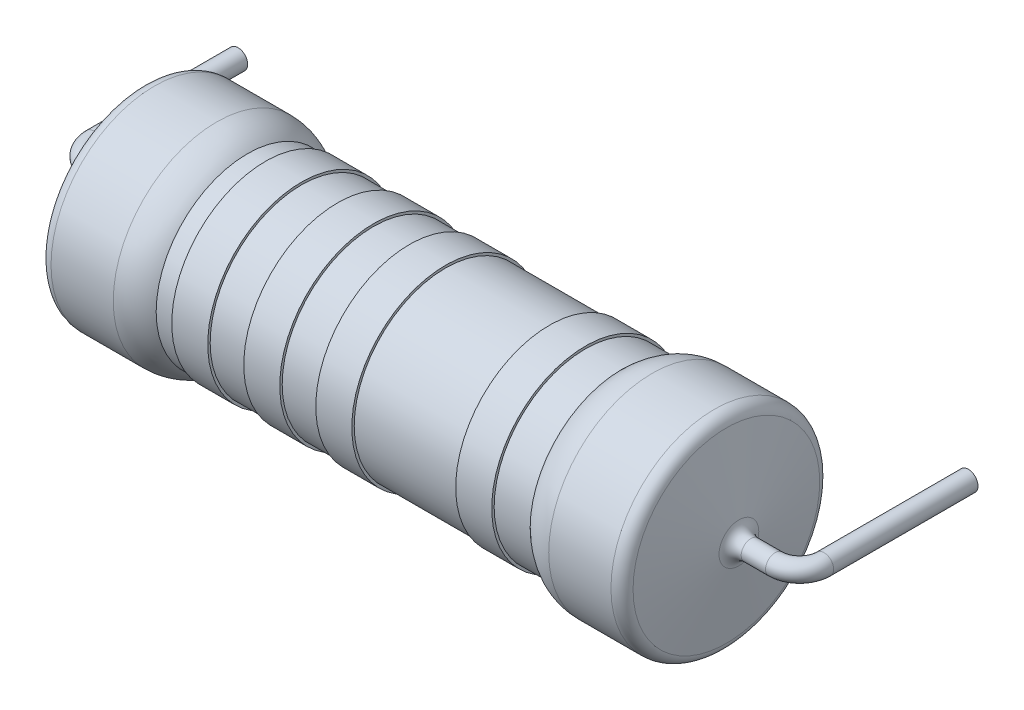
ISO-10303-21;
HEADER;
FILE_DESCRIPTION(('STEP AP214'),'2;1');
FILE_NAME('part.step','',(''),(''),'','','');
FILE_SCHEMA(('AUTOMOTIVE_DESIGN { 1 0 10303 214 1 1 1 1 }'));
ENDSEC;
DATA;
#1=APPLICATION_CONTEXT('core data for automotive mechanical design processes');
#2=APPLICATION_PROTOCOL_DEFINITION('international standard','automotive_design',2000,#1);
#3=PRODUCT_CONTEXT('',#1,'mechanical');
#4=PRODUCT('Part','Part','',(#3));
#5=PRODUCT_RELATED_PRODUCT_CATEGORY('part','',(#4));
#6=PRODUCT_DEFINITION_FORMATION('','',#4);
#7=PRODUCT_DEFINITION_CONTEXT('part definition',#1,'design');
#8=PRODUCT_DEFINITION('design','',#6,#7);
#9=PRODUCT_DEFINITION_SHAPE('','',#8);
#10=(LENGTH_UNIT() NAMED_UNIT(*) SI_UNIT(.MILLI.,.METRE.));
#11=(NAMED_UNIT(*) PLANE_ANGLE_UNIT() SI_UNIT($,.RADIAN.));
#12=(NAMED_UNIT(*) SI_UNIT($,.STERADIAN.) SOLID_ANGLE_UNIT());
#13=UNCERTAINTY_MEASURE_WITH_UNIT(LENGTH_MEASURE(1.E-05),#10,'distance_accuracy_value','');
#14=(GEOMETRIC_REPRESENTATION_CONTEXT(3) GLOBAL_UNCERTAINTY_ASSIGNED_CONTEXT((#13)) GLOBAL_UNIT_ASSIGNED_CONTEXT((#10,
#11,#12)) REPRESENTATION_CONTEXT('',''));
#15=CARTESIAN_POINT('',(0.,0.,0.));
#16=DIRECTION('',(0.,0.,1.));
#17=DIRECTION('',(1.,0.,0.));
#18=AXIS2_PLACEMENT_3D('',#15,#16,#17);
#19=CARTESIAN_POINT('',(-15.,0.2,-6.9292036732051));
#20=DIRECTION('',(0.,0.,-1.));
#21=DIRECTION('',(-1.,0.,0.));
#22=AXIS2_PLACEMENT_3D('',#19,#20,#21);
#23=PLANE('',#22);
#24=CARTESIAN_POINT('',(-15.,0.,-6.9292036732051));
#25=DIRECTION('',(0.,0.,1.));
#26=DIRECTION('',(1.,0.,0.));
#27=AXIS2_PLACEMENT_3D('',#24,#25,#26);
#28=CIRCLE('',#27,0.4);
#29=CARTESIAN_POINT('',(-14.6,0.,-6.9292036732051));
#30=VERTEX_POINT('',#29);
#31=EDGE_CURVE('E16',#30,#30,#28,.T.);
#32=ORIENTED_EDGE('',*,*,#31,.F.);
#33=EDGE_LOOP('',(#32));
#34=FACE_BOUND('',#33,.T.);
#35=ADVANCED_FACE('F13',(#34),#23,.T.);
#36=CARTESIAN_POINT('',(-15.,0.,-2.6792036732051));
#37=DIRECTION('',(0.,0.,1.));
#38=DIRECTION('',(1.,0.,0.));
#39=AXIS2_PLACEMENT_3D('',#36,#37,#38);
#40=CYLINDRICAL_SURFACE('',#39,0.4);
#41=CARTESIAN_POINT('',(-15.,0.,-1.));
#42=DIRECTION('',(0.,0.,-1.));
#43=DIRECTION('',(-1.,0.,0.));
#44=AXIS2_PLACEMENT_3D('',#41,#42,#43);
#45=CIRCLE('',#44,0.4);
#46=CARTESIAN_POINT('',(-15.4,0.,-1.));
#47=VERTEX_POINT('',#46);
#48=EDGE_CURVE('E140',#47,#47,#45,.F.);
#49=ORIENTED_EDGE('',*,*,#48,.F.);
#50=EDGE_LOOP('',(#49));
#51=FACE_BOUND('',#50,.T.);
#52=ORIENTED_EDGE('',*,*,#31,.T.);
#53=EDGE_LOOP('',(#52));
#54=FACE_BOUND('',#53,.T.);
#55=ADVANCED_FACE('F146',(#51,#54),#40,.T.);
#56=CARTESIAN_POINT('',(-14.,0.,-1.));
#57=DIRECTION('',(0.,-1.,0.));
#58=DIRECTION('',(0.,0.,-1.));
#59=AXIS2_PLACEMENT_3D('',#56,#57,#58);
#60=TOROIDAL_SURFACE('',#59,1.,0.4);
#61=CARTESIAN_POINT('',(-14.,0.,0.));
#62=DIRECTION('',(1.,0.,0.));
#63=DIRECTION('',(0.,0.,-1.));
#64=AXIS2_PLACEMENT_3D('',#61,#62,#63);
#65=CIRCLE('',#64,0.4);
#66=CARTESIAN_POINT('',(-14.,0.,-0.4));
#67=VERTEX_POINT('',#66);
#68=EDGE_CURVE('E135',#67,#67,#65,.T.);
#69=ORIENTED_EDGE('',*,*,#68,.F.);
#70=EDGE_LOOP('',(#69));
#71=FACE_BOUND('',#70,.T.);
#72=ORIENTED_EDGE('',*,*,#48,.T.);
#73=EDGE_LOOP('',(#72));
#74=FACE_BOUND('',#73,.T.);
#75=ADVANCED_FACE('F144',(#71,#74),#60,.T.);
#76=CARTESIAN_POINT('',(-17.25,0.,0.));
#77=DIRECTION('',(1.,0.,0.));
#78=DIRECTION('',(0.,0.,-1.));
#79=AXIS2_PLACEMENT_3D('',#76,#77,#78);
#80=CYLINDRICAL_SURFACE('',#79,0.4);
#81=CARTESIAN_POINT('',(-13.,0.,0.));
#82=DIRECTION('',(1.,0.,0.));
#83=DIRECTION('',(0.,0.,-1.));
#84=AXIS2_PLACEMENT_3D('',#81,#82,#83);
#85=CIRCLE('',#84,0.400000000000004);
#86=CARTESIAN_POINT('',(-13.,0.,-0.400000000000004));
#87=VERTEX_POINT('',#86);
#88=EDGE_CURVE('E131',#87,#87,#85,.F.);
#89=ORIENTED_EDGE('',*,*,#88,.T.);
#90=EDGE_LOOP('',(#89));
#91=FACE_BOUND('',#90,.T.);
#92=ORIENTED_EDGE('',*,*,#68,.T.);
#93=EDGE_LOOP('',(#92));
#94=FACE_BOUND('',#93,.T.);
#95=ADVANCED_FACE('F123',(#91,#94),#80,.T.);
#96=CARTESIAN_POINT('',(-13.,0.,0.));
#97=DIRECTION('',(1.,0.,0.));
#98=DIRECTION('',(0.,0.,-1.));
#99=AXIS2_PLACEMENT_3D('',#96,#97,#98);
#100=TOROIDAL_SURFACE('',#99,0.9,0.499999999999996);
#101=ORIENTED_EDGE('',*,*,#88,.F.);
#102=EDGE_LOOP('',(#101));
#103=FACE_BOUND('',#102,.T.);
#104=CARTESIAN_POINT('',(-12.5071032270512,0.,0.));
#105=DIRECTION('',(1.,0.,0.));
#106=DIRECTION('',(0.,1.,0.));
#107=AXIS2_PLACEMENT_3D('',#104,#105,#106);
#108=CIRCLE('',#107,0.816019241085542);
#109=CARTESIAN_POINT('',(-12.5071032270512,0.,-0.816019241081816));
#110=VERTEX_POINT('',#109);
#111=EDGE_CURVE('E134',#110,#110,#108,.T.);
#112=ORIENTED_EDGE('',*,*,#111,.F.);
#113=EDGE_LOOP('',(#112));
#114=FACE_BOUND('',#113,.T.);
#115=ADVANCED_FACE('F118',(#103,#114),#100,.F.);
#116=CARTESIAN_POINT('',(-11.992896774629,0.,0.));
#117=DIRECTION('',(1.,0.,0.));
#118=DIRECTION('',(0.,0.,-1.));
#119=AXIS2_PLACEMENT_3D('',#116,#117,#118);
#120=CONICAL_SURFACE('',#119,3.83398075911145,1.40203487996269);
#121=CARTESIAN_POINT('',(-11.9928967762545,0.,0.));
#122=DIRECTION('',(1.,0.,0.));
#123=DIRECTION('',(0.,0.,-1.));
#124=AXIS2_PLACEMENT_3D('',#121,#122,#123);
#125=CIRCLE('',#124,3.83398075945071);
#126=CARTESIAN_POINT('',(-11.9928967762545,0.,-3.83398074957118));
#127=VERTEX_POINT('',#126);
#128=EDGE_CURVE('E94',#127,#127,#125,.T.);
#129=CARTESIAN_POINT('',(-12.5071032270512,0.,-0.816019241081816));
#130=CARTESIAN_POINT('',(-12.5017469098554,0.,-0.84745634012858));
#131=CARTESIAN_POINT('',(-12.4963905926596,0.,-0.878893439175344));
#132=CARTESIAN_POINT('',(-12.485677958268,0.,-0.941767637268873));
#133=CARTESIAN_POINT('',(-12.4803216410722,0.,-0.973204736315637));
#134=CARTESIAN_POINT('',(-12.4696090066806,0.,-1.03607893440916));
#135=CARTESIAN_POINT('',(-12.4642526894848,0.,-1.06751603345593));
#136=CARTESIAN_POINT('',(-12.4535400550932,0.,-1.13039023154946));
#137=CARTESIAN_POINT('',(-12.4481837378974,0.,-1.16182733059622));
#138=CARTESIAN_POINT('',(-12.4374711035058,0.,-1.22470152868975));
#139=CARTESIAN_POINT('',(-12.43211478631,0.,-1.25613862773651));
#140=CARTESIAN_POINT('',(-12.4214021519184,0.,-1.31901282583004));
#141=CARTESIAN_POINT('',(-12.4160458347226,0.,-1.35044992487681));
#142=CARTESIAN_POINT('',(-12.405333200331,0.,-1.41332412297034));
#143=CARTESIAN_POINT('',(-12.3999768831352,0.,-1.4447612220171));
#144=CARTESIAN_POINT('',(-12.3892642487436,0.,-1.50763542011063));
#145=CARTESIAN_POINT('',(-12.3839079315478,0.,-1.53907251915739));
#146=CARTESIAN_POINT('',(-12.3731952971562,0.,-1.60194671725092));
#147=CARTESIAN_POINT('',(-12.3678389799604,0.,-1.63338381629768));
#148=CARTESIAN_POINT('',(-12.3571263455688,0.,-1.69625801439121));
#149=CARTESIAN_POINT('',(-12.351770028373,0.,-1.72769511343798));
#150=CARTESIAN_POINT('',(-12.3410573939814,0.,-1.7905693115315));
#151=CARTESIAN_POINT('',(-12.3357010767856,0.,-1.82200641057827));
#152=CARTESIAN_POINT('',(-12.324988442394,0.,-1.8848806086718));
#153=CARTESIAN_POINT('',(-12.3196321251982,0.,-1.91631770771856));
#154=CARTESIAN_POINT('',(-12.3089194908066,0.,-1.97919190581209));
#155=CARTESIAN_POINT('',(-12.3035631736108,0.,-2.01062900485885));
#156=CARTESIAN_POINT('',(-12.2928505392192,0.,-2.07350320295238));
#157=CARTESIAN_POINT('',(-12.2874942220234,0.,-2.10494030199915));
#158=CARTESIAN_POINT('',(-12.2767815876318,0.,-2.16781450009268));
#159=CARTESIAN_POINT('',(-12.271425270436,0.,-2.19925159913944));
#160=CARTESIAN_POINT('',(-12.2607126360444,0.,-2.26212579723297));
#161=CARTESIAN_POINT('',(-12.2553563188486,0.,-2.29356289627973));
#162=CARTESIAN_POINT('',(-12.244643684457,0.,-2.35643709437326));
#163=CARTESIAN_POINT('',(-12.2392873672612,0.,-2.38787419342002));
#164=CARTESIAN_POINT('',(-12.2285747328696,0.,-2.45074839151355));
#165=CARTESIAN_POINT('',(-12.2232184156738,0.,-2.48218549056032));
#166=CARTESIAN_POINT('',(-12.2125057812822,0.,-2.54505968865384));
#167=CARTESIAN_POINT('',(-12.2071494640864,0.,-2.57649678770061));
#168=CARTESIAN_POINT('',(-12.1964368296948,0.,-2.63937098579414));
#169=CARTESIAN_POINT('',(-12.1910805124991,0.,-2.6708080848409));
#170=CARTESIAN_POINT('',(-12.1803678781075,0.,-2.73368228293443));
#171=CARTESIAN_POINT('',(-12.1750115609117,0.,-2.76511938198119));
#172=CARTESIAN_POINT('',(-12.1642989265201,0.,-2.82799358007472));
#173=CARTESIAN_POINT('',(-12.1589426093243,0.,-2.85943067912149));
#174=CARTESIAN_POINT('',(-12.1482299749327,0.,-2.92230487721502));
#175=CARTESIAN_POINT('',(-12.1428736577369,0.,-2.95374197626178));
#176=CARTESIAN_POINT('',(-12.1321610233453,0.,-3.01661617435531));
#177=CARTESIAN_POINT('',(-12.1268047061495,0.,-3.04805327340207));
#178=CARTESIAN_POINT('',(-12.1160920717579,0.,-3.1109274714956));
#179=CARTESIAN_POINT('',(-12.1107357545621,0.,-3.14236457054236));
#180=CARTESIAN_POINT('',(-12.1000231201705,0.,-3.20523876863589));
#181=CARTESIAN_POINT('',(-12.0946668029747,0.,-3.23667586768266));
#182=CARTESIAN_POINT('',(-12.0839541685831,0.,-3.29955006577618));
#183=CARTESIAN_POINT('',(-12.0785978513873,0.,-3.33098716482295));
#184=CARTESIAN_POINT('',(-12.0678852169957,0.,-3.39386136291648));
#185=CARTESIAN_POINT('',(-12.0625288997999,0.,-3.42529846196324));
#186=CARTESIAN_POINT('',(-12.0518162654083,0.,-3.48817266005677));
#187=CARTESIAN_POINT('',(-12.0464599482125,0.,-3.51960975910353));
#188=CARTESIAN_POINT('',(-12.0357473138209,0.,-3.58248395719706));
#189=CARTESIAN_POINT('',(-12.0303909966251,0.,-3.61392105624383));
#190=CARTESIAN_POINT('',(-12.0196783622335,0.,-3.67679525433735));
#191=CARTESIAN_POINT('',(-12.0143220450377,0.,-3.70823235338412));
#192=CARTESIAN_POINT('',(-12.0036094106461,0.,-3.77110655147765));
#193=CARTESIAN_POINT('',(-11.9982530934503,0.,-3.80254365052441));
#194=CARTESIAN_POINT('',(-11.9928967762545,0.,-3.83398074957118));
#195=B_SPLINE_CURVE_WITH_KNOTS('',3,(#129,#130,#131,#132,#133,#134,#135,#136,#137,#138,#139,
#140,#141,#142,#143,#144,#145,#146,#147,#148,#149,#150,#151,#152,#153,#154,#155,#156,#157,#158,
#159,#160,#161,#162,#163,#164,#165,#166,#167,#168,#169,#170,#171,#172,#173,#174,#175,#176,#177,
#178,#179,#180,#181,#182,#183,#184,#185,#186,#187,#188,#189,#190,#191,#192,#193,#194),
.UNSPECIFIED.,.F.,.F.,(4,2,2,2,2,2,2,2,2,2,2,2,2,2,2,2,2,2,2,2,2,2,2,2,2,2,2,2,2,2,2,2,4),(0.,
0.0956704341654333,0.191340868330867,0.287011302496301,0.382681736661735,0.478352170827169,
0.574022604992603,0.669693039158037,0.765363473323471,0.861033907488905,0.956704341654339,
1.05237477581977,1.14804520998521,1.24371564415064,1.33938607831607,1.43505651248151,
1.53072694664694,1.62639738081238,1.72206781497781,1.81773824914324,1.91340868330868,
2.00907911747411,2.10474955163955,2.20041998580498,2.29609041997041,2.39176085413585,
2.48743128830128,2.58310172246672,2.67877215663215,2.77444259079758,2.87011302496302,
2.96578345912845,3.06145389329388),.UNSPECIFIED.);
#196=EDGE_CURVE('BSEAM113',#110,#127,#195,.T.);
#197=ORIENTED_EDGE('',*,*,#111,.T.);
#198=ORIENTED_EDGE('',*,*,#128,.F.);
#199=ORIENTED_EDGE('',*,*,#196,.T.);
#200=ORIENTED_EDGE('',*,*,#196,.F.);
#201=EDGE_LOOP('',(#197,#199,#198,#200));
#202=FACE_BOUND('',#201,.T.);
#203=ADVANCED_FACE('F113',(#202),#120,.T.);
#204=CARTESIAN_POINT('',(-11.5,0.,0.));
#205=DIRECTION('',(1.,0.,0.));
#206=DIRECTION('',(0.,0.,-1.));
#207=AXIS2_PLACEMENT_3D('',#204,#205,#206);
#208=TOROIDAL_SURFACE('',#207,3.75000000000001,0.5);
#209=ORIENTED_EDGE('',*,*,#128,.T.);
#210=EDGE_LOOP('',(#209));
#211=FACE_BOUND('',#210,.T.);
#212=CARTESIAN_POINT('',(-11.5,0.,0.));
#213=DIRECTION('',(1.,0.,0.));
#214=DIRECTION('',(0.,0.,-1.));
#215=AXIS2_PLACEMENT_3D('',#212,#213,#214);
#216=CIRCLE('',#215,4.25000000000002);
#217=CARTESIAN_POINT('',(-11.5,0.,-4.25000000000002));
#218=VERTEX_POINT('',#217);
#219=EDGE_CURVE('E89',#218,#218,#216,.T.);
#220=ORIENTED_EDGE('',*,*,#219,.F.);
#221=EDGE_LOOP('',(#220));
#222=FACE_BOUND('',#221,.T.);
#223=ADVANCED_FACE('F108',(#211,#222),#208,.T.);
#224=CARTESIAN_POINT('',(-10.2222222222222,0.,0.));
#225=DIRECTION('',(1.,0.,0.));
#226=DIRECTION('',(0.,0.,-1.));
#227=AXIS2_PLACEMENT_3D('',#224,#225,#226);
#228=CYLINDRICAL_SURFACE('',#227,4.25000000000002);
#229=ORIENTED_EDGE('',*,*,#219,.T.);
#230=EDGE_LOOP('',(#229));
#231=FACE_BOUND('',#230,.T.);
#232=CARTESIAN_POINT('',(-8.94444444444443,0.,0.));
#233=DIRECTION('',(1.,0.,0.));
#234=DIRECTION('',(0.,0.,-1.));
#235=AXIS2_PLACEMENT_3D('',#232,#233,#234);
#236=CIRCLE('',#235,4.25000000000002);
#237=CARTESIAN_POINT('',(-8.94444444444443,0.,-4.25000000000002));
#238=VERTEX_POINT('',#237);
#239=EDGE_CURVE('E82',#238,#238,#236,.T.);
#240=ORIENTED_EDGE('',*,*,#239,.F.);
#241=EDGE_LOOP('',(#240));
#242=FACE_BOUND('',#241,.T.);
#243=ADVANCED_FACE('F112',(#231,#242),#228,.T.);
#244=CARTESIAN_POINT('',(15.,0.2,-6.9292036732051));
#245=DIRECTION('',(0.,0.,-1.));
#246=DIRECTION('',(-1.,0.,0.));
#247=AXIS2_PLACEMENT_3D('',#244,#245,#246);
#248=PLANE('',#247);
#249=CARTESIAN_POINT('',(15.,0.,-6.9292036732051));
#250=DIRECTION('',(0.,0.,-1.));
#251=DIRECTION('',(-1.,0.,0.));
#252=AXIS2_PLACEMENT_3D('',#249,#250,#251);
#253=CIRCLE('',#252,0.4);
#254=CARTESIAN_POINT('',(14.6,0.,-6.9292036732051));
#255=VERTEX_POINT('',#254);
#256=EDGE_CURVE('E79',#255,#255,#253,.F.);
#257=ORIENTED_EDGE('',*,*,#256,.F.);
#258=EDGE_LOOP('',(#257));
#259=FACE_BOUND('',#258,.T.);
#260=ADVANCED_FACE('F295',(#259),#248,.T.);
#261=CARTESIAN_POINT('',(-8.94444444444443,0.,0.));
#262=DIRECTION('',(1.,0.,0.));
#263=DIRECTION('',(0.,0.,-1.));
#264=AXIS2_PLACEMENT_3D('',#261,#262,#263);
#265=TOROIDAL_SURFACE('',#264,2.40847678537188,1.84152321462815);
#266=ORIENTED_EDGE('',*,*,#239,.T.);
#267=EDGE_LOOP('',(#266));
#268=FACE_BOUND('',#267,.T.);
#269=CARTESIAN_POINT('',(-7.64229089168111,0.,0.));
#270=DIRECTION('',(-1.,0.,0.));
#271=DIRECTION('',(0.,1.,0.));
#272=AXIS2_PLACEMENT_3D('',#269,#270,#271);
#273=CIRCLE('',#272,3.71063033821883);
#274=CARTESIAN_POINT('',(-7.64229089168111,3.71063033821883,0.));
#275=VERTEX_POINT('',#274);
#276=EDGE_CURVE('E81',#275,#275,#273,.T.);
#277=ORIENTED_EDGE('',*,*,#276,.T.);
#278=EDGE_LOOP('',(#277));
#279=FACE_BOUND('',#278,.T.);
#280=ADVANCED_FACE('F292',(#268,#279),#265,.T.);
#281=CARTESIAN_POINT('',(15.,0.,-2.6792036732051));
#282=DIRECTION('',(0.,0.,-1.));
#283=DIRECTION('',(-1.,0.,0.));
#284=AXIS2_PLACEMENT_3D('',#281,#282,#283);
#285=CYLINDRICAL_SURFACE('',#284,0.4);
#286=CARTESIAN_POINT('',(15.,0.,-1.));
#287=DIRECTION('',(0.,0.,-1.));
#288=DIRECTION('',(1.,0.,0.));
#289=AXIS2_PLACEMENT_3D('',#286,#287,#288);
#290=CIRCLE('',#289,0.4);
#291=CARTESIAN_POINT('',(15.4,0.,-1.));
#292=VERTEX_POINT('',#291);
#293=EDGE_CURVE('E86',#292,#292,#290,.F.);
#294=ORIENTED_EDGE('',*,*,#293,.F.);
#295=EDGE_LOOP('',(#294));
#296=FACE_BOUND('',#295,.T.);
#297=ORIENTED_EDGE('',*,*,#256,.T.);
#298=EDGE_LOOP('',(#297));
#299=FACE_BOUND('',#298,.T.);
#300=ADVANCED_FACE('F288',(#296,#299),#285,.T.);
#301=CARTESIAN_POINT('',(-7.68166055348729,0.,0.));
#302=DIRECTION('',(-1.,0.,0.));
#303=DIRECTION('',(0.,0.,1.));
#304=AXIS2_PLACEMENT_3D('',#301,#302,#303);
#305=CONICAL_SURFACE('',#304,3.74999999991132,0.785398162675529);
#306=ORIENTED_EDGE('',*,*,#276,.F.);
#307=EDGE_LOOP('',(#306));
#308=FACE_BOUND('',#307,.T.);
#309=CARTESIAN_POINT('',(-7.68166055352042,0.,0.));
#310=DIRECTION('',(1.,0.,0.));
#311=DIRECTION('',(0.,0.,-1.));
#312=AXIS2_PLACEMENT_3D('',#309,#310,#311);
#313=CIRCLE('',#312,3.74999999999995);
#314=CARTESIAN_POINT('',(-7.68166055352042,0.,-3.74999999999995));
#315=VERTEX_POINT('',#314);
#316=EDGE_CURVE('E268',#315,#315,#313,.T.);
#317=ORIENTED_EDGE('',*,*,#316,.F.);
#318=EDGE_LOOP('',(#317));
#319=FACE_BOUND('',#318,.T.);
#320=ADVANCED_FACE('F284',(#308,#319),#305,.F.);
#321=CARTESIAN_POINT('',(14.,0.,-1.));
#322=DIRECTION('',(0.,1.,0.));
#323=DIRECTION('',(0.,0.,1.));
#324=AXIS2_PLACEMENT_3D('',#321,#322,#323);
#325=TOROIDAL_SURFACE('',#324,1.,0.4);
#326=CARTESIAN_POINT('',(14.,0.,0.));
#327=DIRECTION('',(1.,0.,0.));
#328=DIRECTION('',(0.,0.,-1.));
#329=AXIS2_PLACEMENT_3D('',#326,#327,#328);
#330=CIRCLE('',#329,0.4);
#331=CARTESIAN_POINT('',(14.,0.,-0.4));
#332=VERTEX_POINT('',#331);
#333=EDGE_CURVE('E78',#332,#332,#330,.F.);
#334=ORIENTED_EDGE('',*,*,#333,.F.);
#335=EDGE_LOOP('',(#334));
#336=FACE_BOUND('',#335,.T.);
#337=ORIENTED_EDGE('',*,*,#293,.T.);
#338=EDGE_LOOP('',(#337));
#339=FACE_BOUND('',#338,.T.);
#340=ADVANCED_FACE('F279',(#336,#339),#325,.T.);
#341=CARTESIAN_POINT('',(0.,0.,0.));
#342=DIRECTION('',(1.,0.,0.));
#343=DIRECTION('',(0.,0.,-1.));
#344=AXIS2_PLACEMENT_3D('',#341,#342,#343);
#345=CYLINDRICAL_SURFACE('',#344,3.74999999999995);
#346=ORIENTED_EDGE('',*,*,#316,.T.);
#347=EDGE_LOOP('',(#346));
#348=FACE_BOUND('',#347,.T.);
#349=CARTESIAN_POINT('',(-6.94203655268967,0.,0.));
#350=DIRECTION('',(1.,0.,0.));
#351=DIRECTION('',(0.,0.,-1.));
#352=AXIS2_PLACEMENT_3D('',#349,#350,#351);
#353=CIRCLE('',#352,3.74999999999995);
#354=CARTESIAN_POINT('',(-6.94203655268967,0.,-3.74999999999995));
#355=VERTEX_POINT('',#354);
#356=EDGE_CURVE('E76',#355,#355,#353,.T.);
#357=ORIENTED_EDGE('',*,*,#356,.F.);
#358=EDGE_LOOP('',(#357));
#359=FACE_BOUND('',#358,.T.);
#360=ADVANCED_FACE('F283',(#348,#359),#345,.T.);
#361=CARTESIAN_POINT('',(17.25,0.,0.));
#362=DIRECTION('',(1.,0.,0.));
#363=DIRECTION('',(0.,0.,-1.));
#364=AXIS2_PLACEMENT_3D('',#361,#362,#363);
#365=CYLINDRICAL_SURFACE('',#364,0.4);
#366=CARTESIAN_POINT('',(13.,0.,0.));
#367=DIRECTION('',(1.,0.,0.));
#368=DIRECTION('',(0.,0.,-1.));
#369=AXIS2_PLACEMENT_3D('',#366,#367,#368);
#370=CIRCLE('',#369,0.400000000000004);
#371=CARTESIAN_POINT('',(13.,0.,-0.400000000000004));
#372=VERTEX_POINT('',#371);
#373=EDGE_CURVE('E75',#372,#372,#370,.T.);
#374=ORIENTED_EDGE('',*,*,#373,.T.);
#375=EDGE_LOOP('',(#374));
#376=FACE_BOUND('',#375,.T.);
#377=ORIENTED_EDGE('',*,*,#333,.T.);
#378=EDGE_LOOP('',(#377));
#379=FACE_BOUND('',#378,.T.);
#380=ADVANCED_FACE('F447',(#376,#379),#365,.T.);
#381=CARTESIAN_POINT('',(-6.94203655268967,0.,-3.8));
#382=DIRECTION('',(-1.,0.,0.));
#383=DIRECTION('',(0.,0.,1.));
#384=AXIS2_PLACEMENT_3D('',#381,#382,#383);
#385=PLANE('',#384);
#386=ORIENTED_EDGE('',*,*,#356,.T.);
#387=EDGE_LOOP('',(#386));
#388=FACE_BOUND('',#387,.T.);
#389=CARTESIAN_POINT('',(-6.94203655268967,0.,0.));
#390=DIRECTION('',(1.,0.,0.));
#391=DIRECTION('',(0.,0.,-1.));
#392=AXIS2_PLACEMENT_3D('',#389,#390,#391);
#393=CIRCLE('',#392,3.85);
#394=CARTESIAN_POINT('',(-6.94203655268967,0.,-3.85));
#395=VERTEX_POINT('',#394);
#396=EDGE_CURVE('E72',#395,#395,#393,.T.);
#397=ORIENTED_EDGE('',*,*,#396,.F.);
#398=EDGE_LOOP('',(#397));
#399=FACE_BOUND('',#398,.T.);
#400=ADVANCED_FACE('F254',(#388,#399),#385,.T.);
#401=CARTESIAN_POINT('',(13.,0.,0.));
#402=DIRECTION('',(1.,0.,0.));
#403=DIRECTION('',(0.,0.,-1.));
#404=AXIS2_PLACEMENT_3D('',#401,#402,#403);
#405=TOROIDAL_SURFACE('',#404,0.9,0.499999999999996);
#406=CARTESIAN_POINT('',(12.5071032270512,0.,0.));
#407=DIRECTION('',(-1.,0.,0.));
#408=DIRECTION('',(0.,1.,0.));
#409=AXIS2_PLACEMENT_3D('',#406,#407,#408);
#410=CIRCLE('',#409,0.816019241085542);
#411=CARTESIAN_POINT('',(12.5071032270512,0.,0.816019241081816));
#412=VERTEX_POINT('',#411);
#413=EDGE_CURVE('E71',#412,#412,#410,.T.);
#414=ORIENTED_EDGE('',*,*,#413,.F.);
#415=EDGE_LOOP('',(#414));
#416=FACE_BOUND('',#415,.T.);
#417=ORIENTED_EDGE('',*,*,#373,.F.);
#418=EDGE_LOOP('',(#417));
#419=FACE_BOUND('',#418,.T.);
#420=ADVANCED_FACE('F249',(#416,#419),#405,.F.);
#421=CARTESIAN_POINT('',(-6.20241255185892,0.,0.));
#422=DIRECTION('',(1.,0.,0.));
#423=DIRECTION('',(0.,0.,-1.));
#424=AXIS2_PLACEMENT_3D('',#421,#422,#423);
#425=CYLINDRICAL_SURFACE('',#424,3.85);
#426=ORIENTED_EDGE('',*,*,#396,.T.);
#427=EDGE_LOOP('',(#426));
#428=FACE_BOUND('',#427,.T.);
#429=CARTESIAN_POINT('',(-5.46278855102816,0.,0.));
#430=DIRECTION('',(1.,0.,0.));
#431=DIRECTION('',(0.,0.,-1.));
#432=AXIS2_PLACEMENT_3D('',#429,#430,#431);
#433=CIRCLE('',#432,3.85);
#434=CARTESIAN_POINT('',(-5.46278855102816,0.,-3.85));
#435=VERTEX_POINT('',#434);
#436=EDGE_CURVE('E68',#435,#435,#433,.T.);
#437=ORIENTED_EDGE('',*,*,#436,.F.);
#438=EDGE_LOOP('',(#437));
#439=FACE_BOUND('',#438,.T.);
#440=ADVANCED_FACE('F245',(#428,#439),#425,.T.);
#441=CARTESIAN_POINT('',(11.992896774629,0.,0.));
#442=DIRECTION('',(-1.,0.,0.));
#443=DIRECTION('',(0.,0.,1.));
#444=AXIS2_PLACEMENT_3D('',#441,#442,#443);
#445=CONICAL_SURFACE('',#444,3.83398075911145,1.40203487996269);
#446=CARTESIAN_POINT('',(11.9928967762545,0.,0.));
#447=DIRECTION('',(1.,0.,0.));
#448=DIRECTION('',(0.,0.,-1.));
#449=AXIS2_PLACEMENT_3D('',#446,#447,#448);
#450=CIRCLE('',#449,3.83398075945071);
#451=CARTESIAN_POINT('',(11.9928967762545,0.,3.83398074957119));
#452=VERTEX_POINT('',#451);
#453=EDGE_CURVE('E67',#452,#452,#450,.F.);
#454=CARTESIAN_POINT('',(11.9928967762545,0.,3.83398074957119));
#455=CARTESIAN_POINT('',(11.9982530934503,0.,3.80254365052442));
#456=CARTESIAN_POINT('',(12.0036094106461,0.,3.77110655147766));
#457=CARTESIAN_POINT('',(12.0143220450377,0.,3.70823235338413));
#458=CARTESIAN_POINT('',(12.0196783622335,0.,3.67679525433736));
#459=CARTESIAN_POINT('',(12.0303909966251,0.,3.61392105624384));
#460=CARTESIAN_POINT('',(12.0357473138209,0.,3.58248395719707));
#461=CARTESIAN_POINT('',(12.0464599482125,0.,3.51960975910354));
#462=CARTESIAN_POINT('',(12.0518162654083,0.,3.48817266005678));
#463=CARTESIAN_POINT('',(12.0625288997999,0.,3.42529846196325));
#464=CARTESIAN_POINT('',(12.0678852169957,0.,3.39386136291649));
#465=CARTESIAN_POINT('',(12.0785978513873,0.,3.33098716482296));
#466=CARTESIAN_POINT('',(12.0839541685831,0.,3.29955006577619));
#467=CARTESIAN_POINT('',(12.0946668029747,0.,3.23667586768266));
#468=CARTESIAN_POINT('',(12.1000231201705,0.,3.2052387686359));
#469=CARTESIAN_POINT('',(12.1107357545621,0.,3.14236457054237));
#470=CARTESIAN_POINT('',(12.1160920717579,0.,3.11092747149561));
#471=CARTESIAN_POINT('',(12.1268047061495,0.,3.04805327340208));
#472=CARTESIAN_POINT('',(12.1321610233453,0.,3.01661617435532));
#473=CARTESIAN_POINT('',(12.1428736577369,0.,2.95374197626179));
#474=CARTESIAN_POINT('',(12.1482299749327,0.,2.92230487721502));
#475=CARTESIAN_POINT('',(12.1589426093243,0.,2.85943067912149));
#476=CARTESIAN_POINT('',(12.1642989265201,0.,2.82799358007473));
#477=CARTESIAN_POINT('',(12.1750115609117,0.,2.7651193819812));
#478=CARTESIAN_POINT('',(12.1803678781075,0.,2.73368228293444));
#479=CARTESIAN_POINT('',(12.191080512499,0.,2.67080808484091));
#480=CARTESIAN_POINT('',(12.1964368296948,0.,2.63937098579414));
#481=CARTESIAN_POINT('',(12.2071494640864,0.,2.57649678770062));
#482=CARTESIAN_POINT('',(12.2125057812822,0.,2.54505968865385));
#483=CARTESIAN_POINT('',(12.2232184156738,0.,2.48218549056032));
#484=CARTESIAN_POINT('',(12.2285747328696,0.,2.45074839151356));
#485=CARTESIAN_POINT('',(12.2392873672612,0.,2.38787419342003));
#486=CARTESIAN_POINT('',(12.244643684457,0.,2.35643709437327));
#487=CARTESIAN_POINT('',(12.2553563188486,0.,2.29356289627974));
#488=CARTESIAN_POINT('',(12.2607126360444,0.,2.26212579723297));
#489=CARTESIAN_POINT('',(12.271425270436,0.,2.19925159913944));
#490=CARTESIAN_POINT('',(12.2767815876318,0.,2.16781450009268));
#491=CARTESIAN_POINT('',(12.2874942220234,0.,2.10494030199915));
#492=CARTESIAN_POINT('',(12.2928505392192,0.,2.07350320295239));
#493=CARTESIAN_POINT('',(12.3035631736108,0.,2.01062900485886));
#494=CARTESIAN_POINT('',(12.3089194908066,0.,1.97919190581209));
#495=CARTESIAN_POINT('',(12.3196321251982,0.,1.91631770771857));
#496=CARTESIAN_POINT('',(12.324988442394,0.,1.8848806086718));
#497=CARTESIAN_POINT('',(12.3357010767856,0.,1.82200641057827));
#498=CARTESIAN_POINT('',(12.3410573939814,0.,1.79056931153151));
#499=CARTESIAN_POINT('',(12.351770028373,0.,1.72769511343798));
#500=CARTESIAN_POINT('',(12.3571263455688,0.,1.69625801439122));
#501=CARTESIAN_POINT('',(12.3678389799604,0.,1.63338381629769));
#502=CARTESIAN_POINT('',(12.3731952971562,0.,1.60194671725092));
#503=CARTESIAN_POINT('',(12.3839079315478,0.,1.53907251915739));
#504=CARTESIAN_POINT('',(12.3892642487436,0.,1.50763542011063));
#505=CARTESIAN_POINT('',(12.3999768831352,0.,1.4447612220171));
#506=CARTESIAN_POINT('',(12.405333200331,0.,1.41332412297034));
#507=CARTESIAN_POINT('',(12.4160458347226,0.,1.35044992487681));
#508=CARTESIAN_POINT('',(12.4214021519184,0.,1.31901282583004));
#509=CARTESIAN_POINT('',(12.43211478631,0.,1.25613862773652));
#510=CARTESIAN_POINT('',(12.4374711035058,0.,1.22470152868975));
#511=CARTESIAN_POINT('',(12.4481837378974,0.,1.16182733059622));
#512=CARTESIAN_POINT('',(12.4535400550932,0.,1.13039023154946));
#513=CARTESIAN_POINT('',(12.4642526894848,0.,1.06751603345593));
#514=CARTESIAN_POINT('',(12.4696090066806,0.,1.03607893440917));
#515=CARTESIAN_POINT('',(12.4803216410722,0.,0.973204736315637));
#516=CARTESIAN_POINT('',(12.485677958268,0.,0.941767637268873));
#517=CARTESIAN_POINT('',(12.4963905926596,0.,0.878893439175344));
#518=CARTESIAN_POINT('',(12.5017469098554,0.,0.84745634012858));
#519=CARTESIAN_POINT('',(12.5071032270512,0.,0.816019241081816));
#520=B_SPLINE_CURVE_WITH_KNOTS('',3,(#454,#455,#456,#457,#458,#459,#460,#461,#462,#463,#464,
#465,#466,#467,#468,#469,#470,#471,#472,#473,#474,#475,#476,#477,#478,#479,#480,#481,#482,#483,
#484,#485,#486,#487,#488,#489,#490,#491,#492,#493,#494,#495,#496,#497,#498,#499,#500,#501,#502,
#503,#504,#505,#506,#507,#508,#509,#510,#511,#512,#513,#514,#515,#516,#517,#518,#519),
.UNSPECIFIED.,.F.,.F.,(4,2,2,2,2,2,2,2,2,2,2,2,2,2,2,2,2,2,2,2,2,2,2,2,2,2,2,2,2,2,2,2,4),(0.,
0.0956704341654341,0.191340868330869,0.287011302496303,0.382681736661737,0.478352170827171,
0.574022604992605,0.66969303915804,0.765363473323474,0.861033907488908,0.956704341654342,
1.05237477581978,1.14804520998521,1.24371564415065,1.33938607831608,1.43505651248151,
1.53072694664695,1.62639738081238,1.72206781497782,1.81773824914325,1.91340868330868,
2.00907911747412,2.10474955163955,2.20041998580499,2.29609041997042,2.39176085413586,
2.48743128830129,2.58310172246672,2.67877215663216,2.77444259079759,2.87011302496303,
2.96578345912846,3.0614538932939),.UNSPECIFIED.);
#521=EDGE_CURVE('BSEAM241',#452,#412,#520,.T.);
#522=ORIENTED_EDGE('',*,*,#453,.F.);
#523=ORIENTED_EDGE('',*,*,#413,.T.);
#524=ORIENTED_EDGE('',*,*,#521,.T.);
#525=ORIENTED_EDGE('',*,*,#521,.F.);
#526=EDGE_LOOP('',(#522,#524,#523,#525));
#527=FACE_BOUND('',#526,.T.);
#528=ADVANCED_FACE('F241',(#527),#445,.T.);
#529=CARTESIAN_POINT('',(-5.46278855102816,0.,-3.8));
#530=DIRECTION('',(1.,0.,0.));
#531=DIRECTION('',(0.,0.,-1.));
#532=AXIS2_PLACEMENT_3D('',#529,#530,#531);
#533=PLANE('',#532);
#534=CARTESIAN_POINT('',(-5.46278855102816,0.,0.));
#535=DIRECTION('',(1.,0.,0.));
#536=DIRECTION('',(0.,0.,-1.));
#537=AXIS2_PLACEMENT_3D('',#534,#535,#536);
#538=CIRCLE('',#537,3.74999999999995);
#539=CARTESIAN_POINT('',(-5.46278855102816,0.,-3.74999999999995));
#540=VERTEX_POINT('',#539);
#541=EDGE_CURVE('E64',#540,#540,#538,.T.);
#542=ORIENTED_EDGE('',*,*,#541,.F.);
#543=EDGE_LOOP('',(#542));
#544=FACE_BOUND('',#543,.T.);
#545=ORIENTED_EDGE('',*,*,#436,.T.);
#546=EDGE_LOOP('',(#545));
#547=FACE_BOUND('',#546,.T.);
#548=ADVANCED_FACE('F237',(#544,#547),#533,.T.);
#549=CARTESIAN_POINT('',(11.5,0.,0.));
#550=DIRECTION('',(1.,0.,0.));
#551=DIRECTION('',(0.,0.,-1.));
#552=AXIS2_PLACEMENT_3D('',#549,#550,#551);
#553=TOROIDAL_SURFACE('',#552,3.75000000000002,0.5);
#554=CARTESIAN_POINT('',(11.5,0.,0.));
#555=DIRECTION('',(1.,0.,0.));
#556=DIRECTION('',(0.,0.,-1.));
#557=AXIS2_PLACEMENT_3D('',#554,#555,#556);
#558=CIRCLE('',#557,4.25000000000002);
#559=CARTESIAN_POINT('',(11.5,0.,-4.25000000000002));
#560=VERTEX_POINT('',#559);
#561=EDGE_CURVE('E63',#560,#560,#558,.F.);
#562=ORIENTED_EDGE('',*,*,#561,.F.);
#563=EDGE_LOOP('',(#562));
#564=FACE_BOUND('',#563,.T.);
#565=ORIENTED_EDGE('',*,*,#453,.T.);
#566=EDGE_LOOP('',(#565));
#567=FACE_BOUND('',#566,.T.);
#568=ADVANCED_FACE('F232',(#564,#567),#553,.T.);
#569=CARTESIAN_POINT('',(0.,0.,0.));
#570=DIRECTION('',(1.,0.,0.));
#571=DIRECTION('',(0.,0.,-1.));
#572=AXIS2_PLACEMENT_3D('',#569,#570,#571);
#573=CYLINDRICAL_SURFACE('',#572,3.74999999999995);
#574=ORIENTED_EDGE('',*,*,#541,.T.);
#575=EDGE_LOOP('',(#574));
#576=FACE_BOUND('',#575,.T.);
#577=CARTESIAN_POINT('',(-3.98354054936666,0.,0.));
#578=DIRECTION('',(1.,0.,0.));
#579=DIRECTION('',(0.,0.,-1.));
#580=AXIS2_PLACEMENT_3D('',#577,#578,#579);
#581=CIRCLE('',#580,3.74999999999995);
#582=CARTESIAN_POINT('',(-3.98354054936666,0.,-3.74999999999995));
#583=VERTEX_POINT('',#582);
#584=EDGE_CURVE('E60',#583,#583,#581,.T.);
#585=ORIENTED_EDGE('',*,*,#584,.F.);
#586=EDGE_LOOP('',(#585));
#587=FACE_BOUND('',#586,.T.);
#588=ADVANCED_FACE('F236',(#576,#587),#573,.T.);
#589=CARTESIAN_POINT('',(10.2222222222222,0.,0.));
#590=DIRECTION('',(1.,0.,0.));
#591=DIRECTION('',(0.,0.,-1.));
#592=AXIS2_PLACEMENT_3D('',#589,#590,#591);
#593=CYLINDRICAL_SURFACE('',#592,4.25000000000002);
#594=CARTESIAN_POINT('',(8.94444444444443,0.,0.));
#595=DIRECTION('',(1.,0.,0.));
#596=DIRECTION('',(0.,0.,-1.));
#597=AXIS2_PLACEMENT_3D('',#594,#595,#596);
#598=CIRCLE('',#597,4.25000000000002);
#599=CARTESIAN_POINT('',(8.94444444444443,0.,-4.25000000000002));
#600=VERTEX_POINT('',#599);
#601=EDGE_CURVE('E59',#600,#600,#598,.F.);
#602=ORIENTED_EDGE('',*,*,#601,.F.);
#603=EDGE_LOOP('',(#602));
#604=FACE_BOUND('',#603,.T.);
#605=ORIENTED_EDGE('',*,*,#561,.T.);
#606=EDGE_LOOP('',(#605));
#607=FACE_BOUND('',#606,.T.);
#608=ADVANCED_FACE('F534',(#604,#607),#593,.T.);
#609=CARTESIAN_POINT('',(-3.98354054936666,0.,-3.8));
#610=DIRECTION('',(-1.,0.,0.));
#611=DIRECTION('',(0.,0.,1.));
#612=AXIS2_PLACEMENT_3D('',#609,#610,#611);
#613=PLANE('',#612);
#614=ORIENTED_EDGE('',*,*,#584,.T.);
#615=EDGE_LOOP('',(#614));
#616=FACE_BOUND('',#615,.T.);
#617=CARTESIAN_POINT('',(-3.98354054936666,0.,0.));
#618=DIRECTION('',(1.,0.,0.));
#619=DIRECTION('',(0.,0.,-1.));
#620=AXIS2_PLACEMENT_3D('',#617,#618,#619);
#621=CIRCLE('',#620,3.85);
#622=CARTESIAN_POINT('',(-3.98354054936666,0.,-3.85));
#623=VERTEX_POINT('',#622);
#624=EDGE_CURVE('E56',#623,#623,#621,.T.);
#625=ORIENTED_EDGE('',*,*,#624,.F.);
#626=EDGE_LOOP('',(#625));
#627=FACE_BOUND('',#626,.T.);
#628=ADVANCED_FACE('F212',(#616,#627),#613,.T.);
#629=CARTESIAN_POINT('',(8.94444444444443,0.,0.));
#630=DIRECTION('',(1.,0.,0.));
#631=DIRECTION('',(0.,0.,-1.));
#632=AXIS2_PLACEMENT_3D('',#629,#630,#631);
#633=TOROIDAL_SURFACE('',#632,2.40847678537188,1.84152321462815);
#634=CARTESIAN_POINT('',(7.64229089162427,0.,0.));
#635=DIRECTION('',(1.,0.,0.));
#636=DIRECTION('',(0.,1.,0.));
#637=AXIS2_PLACEMENT_3D('',#634,#635,#636);
#638=CIRCLE('',#637,3.71063033821883);
#639=CARTESIAN_POINT('',(7.64229089162427,3.71063033821883,0.));
#640=VERTEX_POINT('',#639);
#641=EDGE_CURVE('E55',#640,#640,#638,.T.);
#642=ORIENTED_EDGE('',*,*,#641,.T.);
#643=EDGE_LOOP('',(#642));
#644=FACE_BOUND('',#643,.T.);
#645=ORIENTED_EDGE('',*,*,#601,.T.);
#646=EDGE_LOOP('',(#645));
#647=FACE_BOUND('',#646,.T.);
#648=ADVANCED_FACE('F207',(#644,#647),#633,.T.);
#649=CARTESIAN_POINT('',(-3.24391654853591,0.,0.));
#650=DIRECTION('',(1.,0.,0.));
#651=DIRECTION('',(0.,0.,-1.));
#652=AXIS2_PLACEMENT_3D('',#649,#650,#651);
#653=CYLINDRICAL_SURFACE('',#652,3.85);
#654=ORIENTED_EDGE('',*,*,#624,.T.);
#655=EDGE_LOOP('',(#654));
#656=FACE_BOUND('',#655,.T.);
#657=CARTESIAN_POINT('',(-2.50429254770516,0.,0.));
#658=DIRECTION('',(1.,0.,0.));
#659=DIRECTION('',(0.,0.,-1.));
#660=AXIS2_PLACEMENT_3D('',#657,#658,#659);
#661=CIRCLE('',#660,3.85);
#662=CARTESIAN_POINT('',(-2.50429254770516,0.,-3.85));
#663=VERTEX_POINT('',#662);
#664=EDGE_CURVE('E52',#663,#663,#661,.T.);
#665=ORIENTED_EDGE('',*,*,#664,.F.);
#666=EDGE_LOOP('',(#665));
#667=FACE_BOUND('',#666,.T.);
#668=ADVANCED_FACE('F203',(#656,#667),#653,.T.);
#669=CARTESIAN_POINT('',(7.6816605533736,0.,0.));
#670=DIRECTION('',(1.,0.,0.));
#671=DIRECTION('',(0.,0.,-1.));
#672=AXIS2_PLACEMENT_3D('',#669,#670,#671);
#673=CONICAL_SURFACE('',#672,3.74999999991132,0.785398162675529);
#674=CARTESIAN_POINT('',(7.68166055352042,0.,0.));
#675=DIRECTION('',(1.,0.,0.));
#676=DIRECTION('',(0.,0.,-1.));
#677=AXIS2_PLACEMENT_3D('',#674,#675,#676);
#678=CIRCLE('',#677,3.74999999999995);
#679=CARTESIAN_POINT('',(7.68166055352042,0.,-3.74999999999995));
#680=VERTEX_POINT('',#679);
#681=EDGE_CURVE('E51',#680,#680,#678,.F.);
#682=ORIENTED_EDGE('',*,*,#681,.F.);
#683=EDGE_LOOP('',(#682));
#684=FACE_BOUND('',#683,.T.);
#685=ORIENTED_EDGE('',*,*,#641,.F.);
#686=EDGE_LOOP('',(#685));
#687=FACE_BOUND('',#686,.T.);
#688=ADVANCED_FACE('F199',(#684,#687),#673,.F.);
#689=CARTESIAN_POINT('',(-2.50429254770516,0.,-3.8));
#690=DIRECTION('',(1.,0.,0.));
#691=DIRECTION('',(0.,0.,-1.));
#692=AXIS2_PLACEMENT_3D('',#689,#690,#691);
#693=PLANE('',#692);
#694=CARTESIAN_POINT('',(-2.50429254770516,0.,0.));
#695=DIRECTION('',(1.,0.,0.));
#696=DIRECTION('',(0.,0.,-1.));
#697=AXIS2_PLACEMENT_3D('',#694,#695,#696);
#698=CIRCLE('',#697,3.74999999999995);
#699=CARTESIAN_POINT('',(-2.50429254770516,0.,-3.74999999999995));
#700=VERTEX_POINT('',#699);
#701=EDGE_CURVE('E48',#700,#700,#698,.T.);
#702=ORIENTED_EDGE('',*,*,#701,.F.);
#703=EDGE_LOOP('',(#702));
#704=FACE_BOUND('',#703,.T.);
#705=ORIENTED_EDGE('',*,*,#664,.T.);
#706=EDGE_LOOP('',(#705));
#707=FACE_BOUND('',#706,.T.);
#708=ADVANCED_FACE('F195',(#704,#707),#693,.T.);
#709=CARTESIAN_POINT('',(0.,0.,0.));
#710=DIRECTION('',(1.,0.,0.));
#711=DIRECTION('',(0.,0.,-1.));
#712=AXIS2_PLACEMENT_3D('',#709,#710,#711);
#713=CYLINDRICAL_SURFACE('',#712,3.74999999999995);
#714=ORIENTED_EDGE('',*,*,#681,.T.);
#715=EDGE_LOOP('',(#714));
#716=FACE_BOUND('',#715,.T.);
#717=CARTESIAN_POINT('',(6.20241255185891,0.,0.));
#718=DIRECTION('',(1.,0.,0.));
#719=DIRECTION('',(0.,0.,-1.));
#720=AXIS2_PLACEMENT_3D('',#717,#718,#719);
#721=CIRCLE('',#720,3.74999999999995);
#722=CARTESIAN_POINT('',(6.20241255185891,0.,-3.74999999999995));
#723=VERTEX_POINT('',#722);
#724=EDGE_CURVE('E45',#723,#723,#721,.F.);
#725=ORIENTED_EDGE('',*,*,#724,.F.);
#726=EDGE_LOOP('',(#725));
#727=FACE_BOUND('',#726,.T.);
#728=ADVANCED_FACE('F191',(#716,#727),#713,.T.);
#729=CARTESIAN_POINT('',(0.,0.,0.));
#730=DIRECTION('',(1.,0.,0.));
#731=DIRECTION('',(0.,0.,-1.));
#732=AXIS2_PLACEMENT_3D('',#729,#730,#731);
#733=CYLINDRICAL_SURFACE('',#732,3.74999999999995);
#734=CARTESIAN_POINT('',(-1.02504454604365,0.,0.));
#735=DIRECTION('',(1.,0.,0.));
#736=DIRECTION('',(0.,0.,-1.));
#737=AXIS2_PLACEMENT_3D('',#734,#735,#736);
#738=CIRCLE('',#737,3.74999999999995);
#739=CARTESIAN_POINT('',(-1.02504454604365,0.,-3.74999999999995));
#740=VERTEX_POINT('',#739);
#741=EDGE_CURVE('E42',#740,#740,#738,.T.);
#742=ORIENTED_EDGE('',*,*,#741,.F.);
#743=EDGE_LOOP('',(#742));
#744=FACE_BOUND('',#743,.T.);
#745=ORIENTED_EDGE('',*,*,#701,.T.);
#746=EDGE_LOOP('',(#745));
#747=FACE_BOUND('',#746,.T.);
#748=ADVANCED_FACE('F187',(#744,#747),#733,.T.);
#749=CARTESIAN_POINT('',(6.20241255185891,0.,-3.8));
#750=DIRECTION('',(1.,0.,0.));
#751=DIRECTION('',(0.,0.,-1.));
#752=AXIS2_PLACEMENT_3D('',#749,#750,#751);
#753=PLANE('',#752);
#754=ORIENTED_EDGE('',*,*,#724,.T.);
#755=EDGE_LOOP('',(#754));
#756=FACE_BOUND('',#755,.T.);
#757=CARTESIAN_POINT('',(6.20241255185891,0.,0.));
#758=DIRECTION('',(1.,0.,0.));
#759=DIRECTION('',(0.,0.,-1.));
#760=AXIS2_PLACEMENT_3D('',#757,#758,#759);
#761=CIRCLE('',#760,3.85);
#762=CARTESIAN_POINT('',(6.20241255185891,0.,-3.85));
#763=VERTEX_POINT('',#762);
#764=EDGE_CURVE('E39',#763,#763,#761,.F.);
#765=ORIENTED_EDGE('',*,*,#764,.F.);
#766=EDGE_LOOP('',(#765));
#767=FACE_BOUND('',#766,.T.);
#768=ADVANCED_FACE('F183',(#756,#767),#753,.T.);
#769=CARTESIAN_POINT('',(-1.02504454604365,0.,-3.8));
#770=DIRECTION('',(-1.,0.,0.));
#771=DIRECTION('',(0.,0.,1.));
#772=AXIS2_PLACEMENT_3D('',#769,#770,#771);
#773=PLANE('',#772);
#774=ORIENTED_EDGE('',*,*,#741,.T.);
#775=EDGE_LOOP('',(#774));
#776=FACE_BOUND('',#775,.T.);
#777=CARTESIAN_POINT('',(-1.02504454604365,0.,0.));
#778=DIRECTION('',(1.,0.,0.));
#779=DIRECTION('',(0.,0.,-1.));
#780=AXIS2_PLACEMENT_3D('',#777,#778,#779);
#781=CIRCLE('',#780,3.85);
#782=CARTESIAN_POINT('',(-1.02504454604365,0.,-3.85));
#783=VERTEX_POINT('',#782);
#784=EDGE_CURVE('E36',#783,#783,#781,.T.);
#785=ORIENTED_EDGE('',*,*,#784,.F.);
#786=EDGE_LOOP('',(#785));
#787=FACE_BOUND('',#786,.T.);
#788=ADVANCED_FACE('F179',(#776,#787),#773,.T.);
#789=CARTESIAN_POINT('',(5.46278855102816,0.,0.));
#790=DIRECTION('',(1.,0.,0.));
#791=DIRECTION('',(0.,0.,-1.));
#792=AXIS2_PLACEMENT_3D('',#789,#790,#791);
#793=CYLINDRICAL_SURFACE('',#792,3.85);
#794=CARTESIAN_POINT('',(4.72316455019741,0.,0.));
#795=DIRECTION('',(1.,0.,0.));
#796=DIRECTION('',(0.,0.,-1.));
#797=AXIS2_PLACEMENT_3D('',#794,#795,#796);
#798=CIRCLE('',#797,3.85);
#799=CARTESIAN_POINT('',(4.72316455019741,0.,-3.85));
#800=VERTEX_POINT('',#799);
#801=EDGE_CURVE('E33',#800,#800,#798,.F.);
#802=ORIENTED_EDGE('',*,*,#801,.F.);
#803=EDGE_LOOP('',(#802));
#804=FACE_BOUND('',#803,.T.);
#805=ORIENTED_EDGE('',*,*,#764,.T.);
#806=EDGE_LOOP('',(#805));
#807=FACE_BOUND('',#806,.T.);
#808=ADVANCED_FACE('F175',(#804,#807),#793,.T.);
#809=CARTESIAN_POINT('',(-0.285420545212901,0.,0.));
#810=DIRECTION('',(1.,0.,0.));
#811=DIRECTION('',(0.,0.,-1.));
#812=AXIS2_PLACEMENT_3D('',#809,#810,#811);
#813=CYLINDRICAL_SURFACE('',#812,3.85);
#814=ORIENTED_EDGE('',*,*,#784,.T.);
#815=EDGE_LOOP('',(#814));
#816=FACE_BOUND('',#815,.T.);
#817=CARTESIAN_POINT('',(0.454203455617851,0.,0.));
#818=DIRECTION('',(1.,0.,0.));
#819=DIRECTION('',(0.,0.,-1.));
#820=AXIS2_PLACEMENT_3D('',#817,#818,#819);
#821=CIRCLE('',#820,3.85);
#822=CARTESIAN_POINT('',(0.454203455617851,0.,-3.85));
#823=VERTEX_POINT('',#822);
#824=EDGE_CURVE('E25',#823,#823,#821,.T.);
#825=ORIENTED_EDGE('',*,*,#824,.F.);
#826=EDGE_LOOP('',(#825));
#827=FACE_BOUND('',#826,.T.);
#828=ADVANCED_FACE('F171',(#816,#827),#813,.T.);
#829=CARTESIAN_POINT('',(4.72316455019741,0.,-3.8));
#830=DIRECTION('',(-1.,0.,0.));
#831=DIRECTION('',(0.,0.,1.));
#832=AXIS2_PLACEMENT_3D('',#829,#830,#831);
#833=PLANE('',#832);
#834=CARTESIAN_POINT('',(4.72316455019741,0.,0.));
#835=DIRECTION('',(1.,0.,0.));
#836=DIRECTION('',(0.,0.,-1.));
#837=AXIS2_PLACEMENT_3D('',#834,#835,#836);
#838=CIRCLE('',#837,3.74999999999995);
#839=CARTESIAN_POINT('',(4.72316455019741,0.,-3.74999999999995));
#840=VERTEX_POINT('',#839);
#841=EDGE_CURVE('E20',#840,#840,#838,.F.);
#842=ORIENTED_EDGE('',*,*,#841,.F.);
#843=EDGE_LOOP('',(#842));
#844=FACE_BOUND('',#843,.T.);
#845=ORIENTED_EDGE('',*,*,#801,.T.);
#846=EDGE_LOOP('',(#845));
#847=FACE_BOUND('',#846,.T.);
#848=ADVANCED_FACE('F164',(#844,#847),#833,.T.);
#849=CARTESIAN_POINT('',(0.454203455617852,0.,-3.8));
#850=DIRECTION('',(1.,0.,0.));
#851=DIRECTION('',(0.,0.,-1.));
#852=AXIS2_PLACEMENT_3D('',#849,#850,#851);
#853=PLANE('',#852);
#854=CARTESIAN_POINT('',(0.454203455617852,0.,0.));
#855=DIRECTION('',(1.,0.,0.));
#856=DIRECTION('',(0.,0.,-1.));
#857=AXIS2_PLACEMENT_3D('',#854,#855,#856);
#858=CIRCLE('',#857,3.74999999999995);
#859=CARTESIAN_POINT('',(0.454203455617852,0.,-3.74999999999995));
#860=VERTEX_POINT('',#859);
#861=EDGE_CURVE('E8',#860,#860,#858,.T.);
#862=ORIENTED_EDGE('',*,*,#861,.F.);
#863=EDGE_LOOP('',(#862));
#864=FACE_BOUND('',#863,.T.);
#865=ORIENTED_EDGE('',*,*,#824,.T.);
#866=EDGE_LOOP('',(#865));
#867=FACE_BOUND('',#866,.T.);
#868=ADVANCED_FACE('F159',(#864,#867),#853,.T.);
#869=CARTESIAN_POINT('',(0.,0.,0.));
#870=DIRECTION('',(1.,0.,0.));
#871=DIRECTION('',(0.,0.,-1.));
#872=AXIS2_PLACEMENT_3D('',#869,#870,#871);
#873=CYLINDRICAL_SURFACE('',#872,3.74999999999995);
#874=ORIENTED_EDGE('',*,*,#861,.T.);
#875=EDGE_LOOP('',(#874));
#876=FACE_BOUND('',#875,.T.);
#877=ORIENTED_EDGE('',*,*,#841,.T.);
#878=EDGE_LOOP('',(#877));
#879=FACE_BOUND('',#878,.T.);
#880=ADVANCED_FACE('F157',(#876,#879),#873,.T.);
#881=CLOSED_SHELL('',(#35,#55,#75,#95,#115,#203,#223,#243,#260,#280,#300,#320,#340,#360,#380,
#400,#420,#440,#528,#548,#568,#588,#608,#628,#648,#668,#688,#708,#728,#748,#768,#788,#808,#828,
#848,#868,#880));
#882=MANIFOLD_SOLID_BREP('B1',#881);
#883=ADVANCED_BREP_SHAPE_REPRESENTATION('',(#18,#882),#14);
#884=SHAPE_DEFINITION_REPRESENTATION(#9,#883);
ENDSEC;
END-ISO-10303-21;
